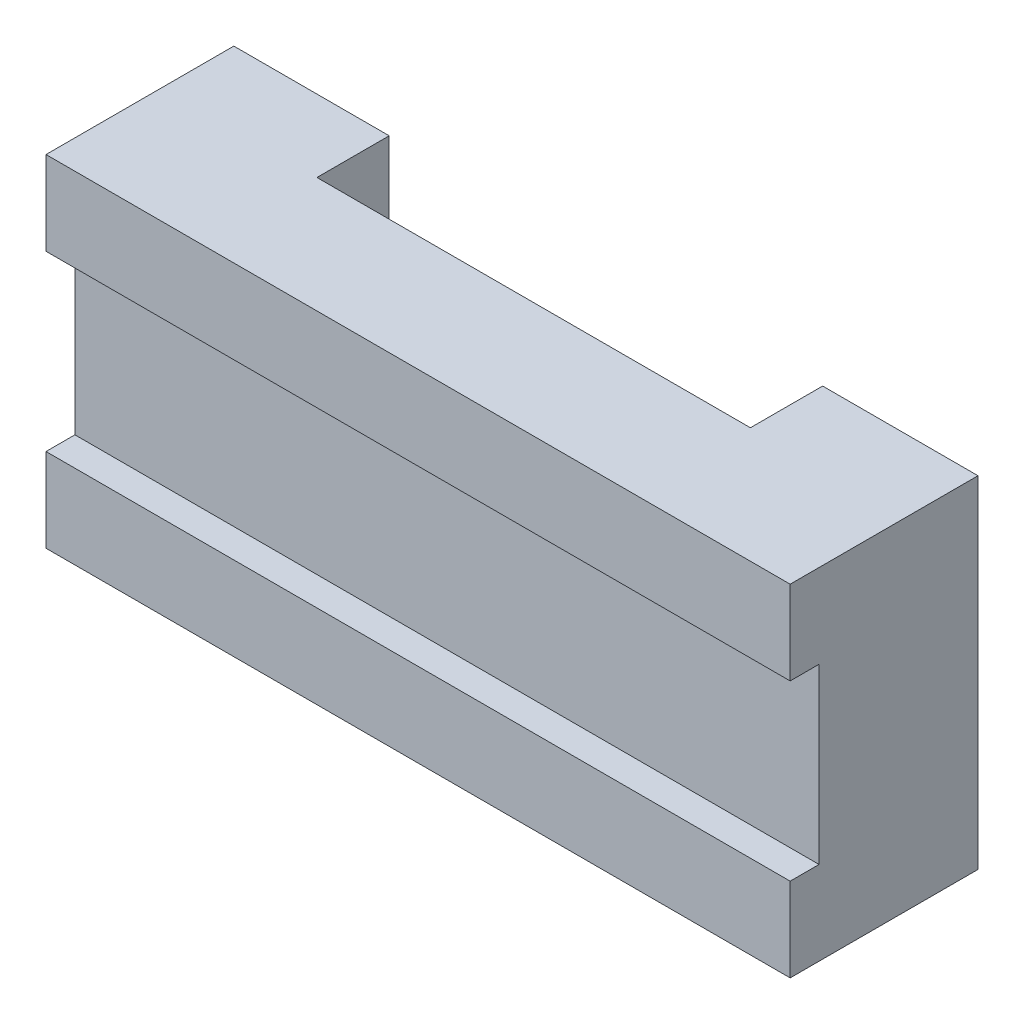
ISO-10303-21;
HEADER;
FILE_DESCRIPTION(('STEP AP214'),'2;1');
FILE_NAME('part.step','',(''),(''),'','','');
FILE_SCHEMA(('AUTOMOTIVE_DESIGN { 1 0 10303 214 1 1 1 1 }'));
ENDSEC;
DATA;
#1=APPLICATION_CONTEXT('core data for automotive mechanical design processes');
#2=APPLICATION_PROTOCOL_DEFINITION('international standard','automotive_design',2000,#1);
#3=PRODUCT_CONTEXT('',#1,'mechanical');
#4=PRODUCT('Part','Part','',(#3));
#5=PRODUCT_RELATED_PRODUCT_CATEGORY('part','',(#4));
#6=PRODUCT_DEFINITION_FORMATION('','',#4);
#7=PRODUCT_DEFINITION_CONTEXT('part definition',#1,'design');
#8=PRODUCT_DEFINITION('design','',#6,#7);
#9=PRODUCT_DEFINITION_SHAPE('','',#8);
#10=(LENGTH_UNIT() NAMED_UNIT(*) SI_UNIT(.MILLI.,.METRE.));
#11=(NAMED_UNIT(*) PLANE_ANGLE_UNIT() SI_UNIT($,.RADIAN.));
#12=(NAMED_UNIT(*) SI_UNIT($,.STERADIAN.) SOLID_ANGLE_UNIT());
#13=UNCERTAINTY_MEASURE_WITH_UNIT(LENGTH_MEASURE(1.E-05),#10,'distance_accuracy_value','');
#14=(GEOMETRIC_REPRESENTATION_CONTEXT(3) GLOBAL_UNCERTAINTY_ASSIGNED_CONTEXT((#13)) GLOBAL_UNIT_ASSIGNED_CONTEXT((#10,
#11,#12)) REPRESENTATION_CONTEXT('',''));
#15=CARTESIAN_POINT('',(0.,0.,0.));
#16=DIRECTION('',(0.,0.,1.));
#17=DIRECTION('',(1.,0.,0.));
#18=AXIS2_PLACEMENT_3D('',#15,#16,#17);
#19=CARTESIAN_POINT('',(0.,0.,0.));
#20=DIRECTION('',(0.,0.,1.));
#21=DIRECTION('',(1.,0.,0.));
#22=AXIS2_PLACEMENT_3D('',#19,#20,#21);
#23=PLANE('',#22);
#24=DIRECTION('',(1.,0.,0.));
#25=VECTOR('',#24,1.);
#26=CARTESIAN_POINT('',(24.,8.20000000000413,0.));
#27=LINE('',#26,#25);
#28=CARTESIAN_POINT('',(64.7514183024394,8.20000000000414,0.));
#29=VERTEX_POINT('',#28);
#30=CARTESIAN_POINT('',(75.5028366048789,8.20000000000414,0.));
#31=VERTEX_POINT('',#30);
#32=EDGE_CURVE('E205',#29,#31,#27,.T.);
#33=ORIENTED_EDGE('',*,*,#32,.F.);
#34=DIRECTION('',(0.,-1.,0.));
#35=VECTOR('',#34,1.);
#36=CARTESIAN_POINT('',(64.7514183024394,31.8000000000037,0.));
#37=LINE('',#36,#35);
#38=CARTESIAN_POINT('',(64.7514183024394,31.8000000000037,0.));
#39=VERTEX_POINT('',#38);
#40=EDGE_CURVE('E154',#39,#29,#37,.T.);
#41=ORIENTED_EDGE('',*,*,#40,.F.);
#42=DIRECTION('',(-1.,0.,0.));
#43=VECTOR('',#42,1.);
#44=CARTESIAN_POINT('',(24.,31.8000000000037,0.));
#45=LINE('',#44,#43);
#46=CARTESIAN_POINT('',(75.5028366048789,31.8000000000037,0.));
#47=VERTEX_POINT('',#46);
#48=EDGE_CURVE('E146',#47,#39,#45,.T.);
#49=ORIENTED_EDGE('',*,*,#48,.F.);
#50=DIRECTION('',(0.,1.,0.));
#51=VECTOR('',#50,1.);
#52=CARTESIAN_POINT('',(75.5028366048789,31.8000000000037,0.));
#53=LINE('',#52,#51);
#54=EDGE_CURVE('E209',#31,#47,#53,.T.);
#55=ORIENTED_EDGE('',*,*,#54,.F.);
#56=EDGE_LOOP('',(#33,#41,#49,#55));
#57=FACE_BOUND('',#56,.T.);
#58=ADVANCED_FACE('F33',(#57),#23,.F.);
#59=CARTESIAN_POINT('',(0.,0.,10.9999999999993));
#60=DIRECTION('',(0.,0.,1.));
#61=DIRECTION('',(1.,0.,0.));
#62=AXIS2_PLACEMENT_3D('',#59,#60,#61);
#63=PLANE('',#62);
#64=DIRECTION('',(1.,0.,0.));
#65=VECTOR('',#64,1.);
#66=CARTESIAN_POINT('',(24.,26.0000000000036,10.9999999999993));
#67=LINE('',#66,#65);
#68=CARTESIAN_POINT('',(24.,26.0000000000036,10.9999999999993));
#69=VERTEX_POINT('',#68);
#70=CARTESIAN_POINT('',(75.5028366048789,26.0000000000036,10.9999999999993));
#71=VERTEX_POINT('',#70);
#72=EDGE_CURVE('E56',#69,#71,#67,.T.);
#73=ORIENTED_EDGE('',*,*,#72,.F.);
#74=DIRECTION('',(0.,-1.,0.));
#75=VECTOR('',#74,1.);
#76=CARTESIAN_POINT('',(24.,31.8000000000037,10.9999999999993));
#77=LINE('',#76,#75);
#78=CARTESIAN_POINT('',(24.,14.0000000000043,10.9999999999993));
#79=VERTEX_POINT('',#78);
#80=EDGE_CURVE('E198',#69,#79,#77,.T.);
#81=ORIENTED_EDGE('',*,*,#80,.T.);
#82=DIRECTION('',(1.,0.,0.));
#83=VECTOR('',#82,1.);
#84=CARTESIAN_POINT('',(24.,14.0000000000043,10.9999999999993));
#85=LINE('',#84,#83);
#86=CARTESIAN_POINT('',(75.5028366048789,14.0000000000043,10.9999999999993));
#87=VERTEX_POINT('',#86);
#88=EDGE_CURVE('E185',#79,#87,#85,.T.);
#89=ORIENTED_EDGE('',*,*,#88,.T.);
#90=DIRECTION('',(0.,1.,0.));
#91=VECTOR('',#90,1.);
#92=CARTESIAN_POINT('',(75.5028366048789,31.8000000000037,10.9999999999993));
#93=LINE('',#92,#91);
#94=EDGE_CURVE('E200',#87,#71,#93,.T.);
#95=ORIENTED_EDGE('',*,*,#94,.T.);
#96=EDGE_LOOP('',(#73,#81,#89,#95));
#97=FACE_BOUND('',#96,.T.);
#98=ADVANCED_FACE('F255',(#97),#63,.T.);
#99=CARTESIAN_POINT('',(24.,31.8000000000037,10.9999999999993));
#100=DIRECTION('',(1.,0.,0.));
#101=DIRECTION('',(0.,0.,-1.));
#102=AXIS2_PLACEMENT_3D('',#99,#100,#101);
#103=PLANE('',#102);
#104=DIRECTION('',(0.,-1.,0.));
#105=VECTOR('',#104,1.);
#106=CARTESIAN_POINT('',(24.,31.8000000000037,0.));
#107=LINE('',#106,#105);
#108=CARTESIAN_POINT('',(24.,31.8000000000037,0.));
#109=VERTEX_POINT('',#108);
#110=CARTESIAN_POINT('',(24.,8.20000000000413,0.));
#111=VERTEX_POINT('',#110);
#112=EDGE_CURVE('E193',#109,#111,#107,.T.);
#113=ORIENTED_EDGE('',*,*,#112,.T.);
#114=DIRECTION('',(0.,0.,-1.));
#115=VECTOR('',#114,1.);
#116=CARTESIAN_POINT('',(24.,8.20000000000413,10.9999999999993));
#117=LINE('',#116,#115);
#118=CARTESIAN_POINT('',(24.,8.20000000000414,12.9999999999993));
#119=VERTEX_POINT('',#118);
#120=EDGE_CURVE('E11',#119,#111,#117,.T.);
#121=ORIENTED_EDGE('',*,*,#120,.F.);
#122=DIRECTION('',(0.,-1.,0.));
#123=VECTOR('',#122,1.);
#124=CARTESIAN_POINT('',(24.,8.20000000000414,12.9999999999993));
#125=LINE('',#124,#123);
#126=CARTESIAN_POINT('',(24.,14.0000000000043,12.9999999999993));
#127=VERTEX_POINT('',#126);
#128=EDGE_CURVE('E181',#127,#119,#125,.T.);
#129=ORIENTED_EDGE('',*,*,#128,.F.);
#130=DIRECTION('',(0.,0.,1.));
#131=VECTOR('',#130,1.);
#132=CARTESIAN_POINT('',(24.,14.0000000000043,12.9999999999993));
#133=LINE('',#132,#131);
#134=EDGE_CURVE('E178',#79,#127,#133,.T.);
#135=ORIENTED_EDGE('',*,*,#134,.F.);
#136=ORIENTED_EDGE('',*,*,#80,.F.);
#137=DIRECTION('',(0.,0.,-1.));
#138=VECTOR('',#137,1.);
#139=CARTESIAN_POINT('',(24.,26.0000000000036,12.9999999999993));
#140=LINE('',#139,#138);
#141=CARTESIAN_POINT('',(24.,26.0000000000036,12.9999999999993));
#142=VERTEX_POINT('',#141);
#143=EDGE_CURVE('E160',#142,#69,#140,.T.);
#144=ORIENTED_EDGE('',*,*,#143,.F.);
#145=DIRECTION('',(0.,-1.,0.));
#146=VECTOR('',#145,1.);
#147=CARTESIAN_POINT('',(24.,31.8000000000037,12.9999999999993));
#148=LINE('',#147,#146);
#149=CARTESIAN_POINT('',(24.,31.8000000000037,12.9999999999993));
#150=VERTEX_POINT('',#149);
#151=EDGE_CURVE('E163',#150,#142,#148,.T.);
#152=ORIENTED_EDGE('',*,*,#151,.F.);
#153=DIRECTION('',(0.,0.,-1.));
#154=VECTOR('',#153,1.);
#155=CARTESIAN_POINT('',(24.,31.8000000000037,10.9999999999993));
#156=LINE('',#155,#154);
#157=EDGE_CURVE('E202',#150,#109,#156,.T.);
#158=ORIENTED_EDGE('',*,*,#157,.T.);
#159=EDGE_LOOP('',(#113,#121,#129,#135,#136,#144,#152,#158));
#160=FACE_BOUND('',#159,.T.);
#161=ADVANCED_FACE('F35',(#160),#103,.F.);
#162=CARTESIAN_POINT('',(24.,8.20000000000413,10.9999999999993));
#163=DIRECTION('',(0.,1.,0.));
#164=DIRECTION('',(-1.,0.,0.));
#165=AXIS2_PLACEMENT_3D('',#162,#163,#164);
#166=PLANE('',#165);
#167=DIRECTION('',(-1.,0.,0.));
#168=VECTOR('',#167,1.);
#169=CARTESIAN_POINT('',(49.7514183024394,8.20000000000414,5.));
#170=LINE('',#169,#168);
#171=CARTESIAN_POINT('',(64.7514183024394,8.20000000000414,5.));
#172=VERTEX_POINT('',#171);
#173=CARTESIAN_POINT('',(34.7514183024394,8.20000000000414,5.));
#174=VERTEX_POINT('',#173);
#175=EDGE_CURVE('E148',#172,#174,#170,.T.);
#176=ORIENTED_EDGE('',*,*,#175,.F.);
#177=DIRECTION('',(0.,0.,1.));
#178=VECTOR('',#177,1.);
#179=CARTESIAN_POINT('',(64.7514183024394,8.20000000000414,0.));
#180=LINE('',#179,#178);
#181=EDGE_CURVE('E128',#29,#172,#180,.T.);
#182=ORIENTED_EDGE('',*,*,#181,.F.);
#183=ORIENTED_EDGE('',*,*,#32,.T.);
#184=DIRECTION('',(0.,0.,-1.));
#185=VECTOR('',#184,1.);
#186=CARTESIAN_POINT('',(75.5028366048789,8.20000000000414,10.9999999999993));
#187=LINE('',#186,#185);
#188=CARTESIAN_POINT('',(75.5028366048789,8.20000000000414,12.9999999999993));
#189=VERTEX_POINT('',#188);
#190=EDGE_CURVE('E41',#189,#31,#187,.T.);
#191=ORIENTED_EDGE('',*,*,#190,.F.);
#192=DIRECTION('',(1.,0.,0.));
#193=VECTOR('',#192,1.);
#194=CARTESIAN_POINT('',(24.,8.20000000000414,12.9999999999993));
#195=LINE('',#194,#193);
#196=EDGE_CURVE('E190',#119,#189,#195,.T.);
#197=ORIENTED_EDGE('',*,*,#196,.F.);
#198=ORIENTED_EDGE('',*,*,#120,.T.);
#199=CARTESIAN_POINT('',(34.7514183024394,8.20000000000413,0.));
#200=VERTEX_POINT('',#199);
#201=EDGE_CURVE('E206',#111,#200,#27,.T.);
#202=ORIENTED_EDGE('',*,*,#201,.T.);
#203=DIRECTION('',(0.,0.,-1.));
#204=VECTOR('',#203,1.);
#205=CARTESIAN_POINT('',(34.7514183024394,8.20000000000414,0.));
#206=LINE('',#205,#204);
#207=EDGE_CURVE('E48',#174,#200,#206,.T.);
#208=ORIENTED_EDGE('',*,*,#207,.F.);
#209=EDGE_LOOP('',(#176,#182,#183,#191,#197,#198,#202,#208));
#210=FACE_BOUND('',#209,.T.);
#211=ADVANCED_FACE('F225',(#210),#166,.F.);
#212=CARTESIAN_POINT('',(75.5028366048789,31.8000000000037,10.9999999999993));
#213=DIRECTION('',(-1.,0.,0.));
#214=DIRECTION('',(0.,0.,1.));
#215=AXIS2_PLACEMENT_3D('',#212,#213,#214);
#216=PLANE('',#215);
#217=ORIENTED_EDGE('',*,*,#54,.T.);
#218=DIRECTION('',(0.,0.,-1.));
#219=VECTOR('',#218,1.);
#220=CARTESIAN_POINT('',(75.5028366048789,31.8000000000037,10.9999999999993));
#221=LINE('',#220,#219);
#222=CARTESIAN_POINT('',(75.5028366048789,31.8000000000037,12.9999999999993));
#223=VERTEX_POINT('',#222);
#224=EDGE_CURVE('E215',#223,#47,#221,.T.);
#225=ORIENTED_EDGE('',*,*,#224,.F.);
#226=DIRECTION('',(0.,-1.,0.));
#227=VECTOR('',#226,1.);
#228=CARTESIAN_POINT('',(75.5028366048789,31.8000000000037,12.9999999999993));
#229=LINE('',#228,#227);
#230=CARTESIAN_POINT('',(75.5028366048789,26.0000000000036,12.9999999999993));
#231=VERTEX_POINT('',#230);
#232=EDGE_CURVE('E164',#223,#231,#229,.T.);
#233=ORIENTED_EDGE('',*,*,#232,.T.);
#234=DIRECTION('',(0.,0.,-1.));
#235=VECTOR('',#234,1.);
#236=CARTESIAN_POINT('',(75.5028366048789,26.0000000000036,12.9999999999993));
#237=LINE('',#236,#235);
#238=EDGE_CURVE('E156',#231,#71,#237,.T.);
#239=ORIENTED_EDGE('',*,*,#238,.T.);
#240=ORIENTED_EDGE('',*,*,#94,.F.);
#241=DIRECTION('',(0.,0.,1.));
#242=VECTOR('',#241,1.);
#243=CARTESIAN_POINT('',(75.5028366048789,14.0000000000043,12.9999999999993));
#244=LINE('',#243,#242);
#245=CARTESIAN_POINT('',(75.5028366048789,14.0000000000043,12.9999999999993));
#246=VERTEX_POINT('',#245);
#247=EDGE_CURVE('E173',#87,#246,#244,.T.);
#248=ORIENTED_EDGE('',*,*,#247,.T.);
#249=DIRECTION('',(0.,-1.,0.));
#250=VECTOR('',#249,1.);
#251=CARTESIAN_POINT('',(75.5028366048789,8.20000000000414,12.9999999999993));
#252=LINE('',#251,#250);
#253=EDGE_CURVE('E182',#246,#189,#252,.T.);
#254=ORIENTED_EDGE('',*,*,#253,.T.);
#255=ORIENTED_EDGE('',*,*,#190,.T.);
#256=EDGE_LOOP('',(#217,#225,#233,#239,#240,#248,#254,#255));
#257=FACE_BOUND('',#256,.T.);
#258=ADVANCED_FACE('F219',(#257),#216,.F.);
#259=CARTESIAN_POINT('',(24.,31.8000000000037,10.9999999999993));
#260=DIRECTION('',(0.,-1.,0.));
#261=DIRECTION('',(0.,0.,-1.));
#262=AXIS2_PLACEMENT_3D('',#259,#260,#261);
#263=PLANE('',#262);
#264=ORIENTED_EDGE('',*,*,#48,.T.);
#265=DIRECTION('',(0.,0.,1.));
#266=VECTOR('',#265,1.);
#267=CARTESIAN_POINT('',(64.7514183024394,31.8000000000037,0.));
#268=LINE('',#267,#266);
#269=CARTESIAN_POINT('',(64.7514183024394,31.8000000000037,5.));
#270=VERTEX_POINT('',#269);
#271=EDGE_CURVE('E125',#39,#270,#268,.T.);
#272=ORIENTED_EDGE('',*,*,#271,.T.);
#273=DIRECTION('',(-1.,0.,0.));
#274=VECTOR('',#273,1.);
#275=CARTESIAN_POINT('',(49.7514183024394,31.8000000000037,5.));
#276=LINE('',#275,#274);
#277=CARTESIAN_POINT('',(34.7514183024394,31.8000000000037,5.));
#278=VERTEX_POINT('',#277);
#279=EDGE_CURVE('E136',#270,#278,#276,.T.);
#280=ORIENTED_EDGE('',*,*,#279,.T.);
#281=DIRECTION('',(0.,0.,-1.));
#282=VECTOR('',#281,1.);
#283=CARTESIAN_POINT('',(34.7514183024394,31.8000000000037,0.));
#284=LINE('',#283,#282);
#285=CARTESIAN_POINT('',(34.7514183024394,31.8000000000037,0.));
#286=VERTEX_POINT('',#285);
#287=EDGE_CURVE('E133',#278,#286,#284,.T.);
#288=ORIENTED_EDGE('',*,*,#287,.T.);
#289=EDGE_CURVE('E211',#286,#109,#45,.T.);
#290=ORIENTED_EDGE('',*,*,#289,.T.);
#291=ORIENTED_EDGE('',*,*,#157,.F.);
#292=DIRECTION('',(1.,0.,0.));
#293=VECTOR('',#292,1.);
#294=CARTESIAN_POINT('',(24.,31.8000000000037,12.9999999999993));
#295=LINE('',#294,#293);
#296=EDGE_CURVE('E174',#150,#223,#295,.T.);
#297=ORIENTED_EDGE('',*,*,#296,.T.);
#298=ORIENTED_EDGE('',*,*,#224,.T.);
#299=EDGE_LOOP('',(#264,#272,#280,#288,#290,#291,#297,#298));
#300=FACE_BOUND('',#299,.T.);
#301=ADVANCED_FACE('F143',(#300),#263,.F.);
#302=ORIENTED_EDGE('',*,*,#289,.F.);
#303=DIRECTION('',(0.,-1.,0.));
#304=VECTOR('',#303,1.);
#305=CARTESIAN_POINT('',(34.7514183024394,31.8000000000037,0.));
#306=LINE('',#305,#304);
#307=EDGE_CURVE('E157',#286,#200,#306,.T.);
#308=ORIENTED_EDGE('',*,*,#307,.T.);
#309=ORIENTED_EDGE('',*,*,#201,.F.);
#310=ORIENTED_EDGE('',*,*,#112,.F.);
#311=EDGE_LOOP('',(#302,#308,#309,#310));
#312=FACE_BOUND('',#311,.T.);
#313=ADVANCED_FACE('F229',(#312),#23,.F.);
#314=CARTESIAN_POINT('',(24.,8.20000000000414,12.9999999999993));
#315=DIRECTION('',(0.,0.,1.));
#316=DIRECTION('',(1.,0.,0.));
#317=AXIS2_PLACEMENT_3D('',#314,#315,#316);
#318=PLANE('',#317);
#319=ORIENTED_EDGE('',*,*,#253,.F.);
#320=DIRECTION('',(1.,0.,0.));
#321=VECTOR('',#320,1.);
#322=CARTESIAN_POINT('',(24.,14.0000000000043,12.9999999999993));
#323=LINE('',#322,#321);
#324=EDGE_CURVE('E194',#127,#246,#323,.T.);
#325=ORIENTED_EDGE('',*,*,#324,.F.);
#326=ORIENTED_EDGE('',*,*,#128,.T.);
#327=ORIENTED_EDGE('',*,*,#196,.T.);
#328=EDGE_LOOP('',(#319,#325,#326,#327));
#329=FACE_BOUND('',#328,.T.);
#330=ADVANCED_FACE('F250',(#329),#318,.T.);
#331=CARTESIAN_POINT('',(24.,14.0000000000043,12.9999999999993));
#332=DIRECTION('',(0.,1.,0.));
#333=DIRECTION('',(0.,0.,1.));
#334=AXIS2_PLACEMENT_3D('',#331,#332,#333);
#335=PLANE('',#334);
#336=ORIENTED_EDGE('',*,*,#247,.F.);
#337=ORIENTED_EDGE('',*,*,#88,.F.);
#338=ORIENTED_EDGE('',*,*,#134,.T.);
#339=ORIENTED_EDGE('',*,*,#324,.T.);
#340=EDGE_LOOP('',(#336,#337,#338,#339));
#341=FACE_BOUND('',#340,.T.);
#342=ADVANCED_FACE('F243',(#341),#335,.T.);
#343=CARTESIAN_POINT('',(24.,26.0000000000036,12.9999999999993));
#344=DIRECTION('',(0.,-1.,0.));
#345=DIRECTION('',(0.,0.,-1.));
#346=AXIS2_PLACEMENT_3D('',#343,#344,#345);
#347=PLANE('',#346);
#348=ORIENTED_EDGE('',*,*,#238,.F.);
#349=DIRECTION('',(1.,0.,0.));
#350=VECTOR('',#349,1.);
#351=CARTESIAN_POINT('',(24.,26.0000000000036,12.9999999999993));
#352=LINE('',#351,#350);
#353=EDGE_CURVE('E171',#142,#231,#352,.T.);
#354=ORIENTED_EDGE('',*,*,#353,.F.);
#355=ORIENTED_EDGE('',*,*,#143,.T.);
#356=ORIENTED_EDGE('',*,*,#72,.T.);
#357=EDGE_LOOP('',(#348,#354,#355,#356));
#358=FACE_BOUND('',#357,.T.);
#359=ADVANCED_FACE('F241',(#358),#347,.T.);
#360=CARTESIAN_POINT('',(24.,31.8000000000037,12.9999999999993));
#361=DIRECTION('',(0.,0.,1.));
#362=DIRECTION('',(1.,0.,0.));
#363=AXIS2_PLACEMENT_3D('',#360,#361,#362);
#364=PLANE('',#363);
#365=ORIENTED_EDGE('',*,*,#232,.F.);
#366=ORIENTED_EDGE('',*,*,#296,.F.);
#367=ORIENTED_EDGE('',*,*,#151,.T.);
#368=ORIENTED_EDGE('',*,*,#353,.T.);
#369=EDGE_LOOP('',(#365,#366,#367,#368));
#370=FACE_BOUND('',#369,.T.);
#371=ADVANCED_FACE('F237',(#370),#364,.T.);
#372=CARTESIAN_POINT('',(64.7514183024394,31.8000000000037,0.));
#373=DIRECTION('',(1.,0.,0.));
#374=DIRECTION('',(0.,1.,0.));
#375=AXIS2_PLACEMENT_3D('',#372,#373,#374);
#376=PLANE('',#375);
#377=ORIENTED_EDGE('',*,*,#181,.T.);
#378=DIRECTION('',(0.,-1.,0.));
#379=VECTOR('',#378,1.);
#380=CARTESIAN_POINT('',(64.7514183024394,31.8000000000037,5.));
#381=LINE('',#380,#379);
#382=EDGE_CURVE('E121',#270,#172,#381,.T.);
#383=ORIENTED_EDGE('',*,*,#382,.F.);
#384=ORIENTED_EDGE('',*,*,#271,.F.);
#385=ORIENTED_EDGE('',*,*,#40,.T.);
#386=EDGE_LOOP('',(#377,#383,#384,#385));
#387=FACE_BOUND('',#386,.T.);
#388=ADVANCED_FACE('F123',(#387),#376,.F.);
#389=CARTESIAN_POINT('',(34.7514183024394,31.8000000000037,0.));
#390=DIRECTION('',(-1.,0.,0.));
#391=DIRECTION('',(0.,-1.,0.));
#392=AXIS2_PLACEMENT_3D('',#389,#390,#391);
#393=PLANE('',#392);
#394=ORIENTED_EDGE('',*,*,#207,.T.);
#395=ORIENTED_EDGE('',*,*,#307,.F.);
#396=ORIENTED_EDGE('',*,*,#287,.F.);
#397=DIRECTION('',(0.,-1.,0.));
#398=VECTOR('',#397,1.);
#399=CARTESIAN_POINT('',(34.7514183024394,31.8000000000037,5.));
#400=LINE('',#399,#398);
#401=EDGE_CURVE('E132',#278,#174,#400,.T.);
#402=ORIENTED_EDGE('',*,*,#401,.T.);
#403=EDGE_LOOP('',(#394,#395,#396,#402));
#404=FACE_BOUND('',#403,.T.);
#405=ADVANCED_FACE('F230',(#404),#393,.F.);
#406=CARTESIAN_POINT('',(49.7514183024394,31.8000000000037,5.));
#407=DIRECTION('',(0.,0.,1.));
#408=DIRECTION('',(1.,0.,0.));
#409=AXIS2_PLACEMENT_3D('',#406,#407,#408);
#410=PLANE('',#409);
#411=ORIENTED_EDGE('',*,*,#175,.T.);
#412=ORIENTED_EDGE('',*,*,#401,.F.);
#413=ORIENTED_EDGE('',*,*,#279,.F.);
#414=ORIENTED_EDGE('',*,*,#382,.T.);
#415=EDGE_LOOP('',(#411,#412,#413,#414));
#416=FACE_BOUND('',#415,.T.);
#417=ADVANCED_FACE('F137',(#416),#410,.F.);
#418=CLOSED_SHELL('',(#58,#98,#161,#211,#258,#301,#313,#330,#342,#359,#371,#388,#405,#417));
#419=MANIFOLD_SOLID_BREP('B2',#418);
#420=ADVANCED_BREP_SHAPE_REPRESENTATION('',(#18,#419),#14);
#421=SHAPE_DEFINITION_REPRESENTATION(#9,#420);
ENDSEC;
END-ISO-10303-21;
